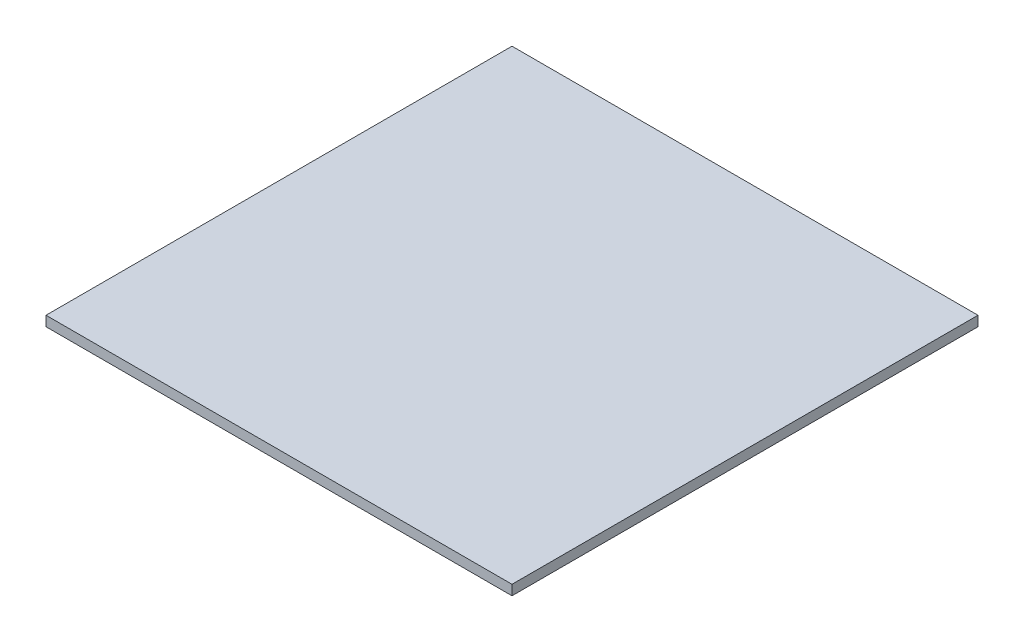
ISO-10303-21;
HEADER;
FILE_DESCRIPTION(('STEP AP214'),'2;1');
FILE_NAME('part.step','',(''),(''),'','','');
FILE_SCHEMA(('AUTOMOTIVE_DESIGN { 1 0 10303 214 1 1 1 1 }'));
ENDSEC;
DATA;
#1=APPLICATION_CONTEXT('core data for automotive mechanical design processes');
#2=APPLICATION_PROTOCOL_DEFINITION('international standard','automotive_design',2000,#1);
#3=PRODUCT_CONTEXT('',#1,'mechanical');
#4=PRODUCT('Part','Part','',(#3));
#5=PRODUCT_RELATED_PRODUCT_CATEGORY('part','',(#4));
#6=PRODUCT_DEFINITION_FORMATION('','',#4);
#7=PRODUCT_DEFINITION_CONTEXT('part definition',#1,'design');
#8=PRODUCT_DEFINITION('design','',#6,#7);
#9=PRODUCT_DEFINITION_SHAPE('','',#8);
#10=(LENGTH_UNIT() NAMED_UNIT(*) SI_UNIT(.MILLI.,.METRE.));
#11=(NAMED_UNIT(*) PLANE_ANGLE_UNIT() SI_UNIT($,.RADIAN.));
#12=(NAMED_UNIT(*) SI_UNIT($,.STERADIAN.) SOLID_ANGLE_UNIT());
#13=UNCERTAINTY_MEASURE_WITH_UNIT(LENGTH_MEASURE(1.E-05),#10,'distance_accuracy_value','');
#14=(GEOMETRIC_REPRESENTATION_CONTEXT(3) GLOBAL_UNCERTAINTY_ASSIGNED_CONTEXT((#13)) GLOBAL_UNIT_ASSIGNED_CONTEXT((#10,
#11,#12)) REPRESENTATION_CONTEXT('',''));
#15=CARTESIAN_POINT('',(0.,0.,0.));
#16=DIRECTION('',(0.,0.,1.));
#17=DIRECTION('',(1.,0.,0.));
#18=AXIS2_PLACEMENT_3D('',#15,#16,#17);
#19=CARTESIAN_POINT('',(0.,6.,0.));
#20=DIRECTION('',(-1.,0.,0.));
#21=DIRECTION('',(0.,0.,1.));
#22=AXIS2_PLACEMENT_3D('',#19,#20,#21);
#23=PLANE('',#22);
#24=DIRECTION('',(0.,0.,-1.));
#25=VECTOR('',#24,1.);
#26=CARTESIAN_POINT('',(0.,0.,0.));
#27=LINE('',#26,#25);
#28=CARTESIAN_POINT('',(0.,0.,0.));
#29=VERTEX_POINT('',#28);
#30=CARTESIAN_POINT('',(0.,0.,-280.));
#31=VERTEX_POINT('',#30);
#32=EDGE_CURVE('E98',#29,#31,#27,.T.);
#33=ORIENTED_EDGE('',*,*,#32,.F.);
#34=DIRECTION('',(0.,-1.,0.));
#35=VECTOR('',#34,1.);
#36=CARTESIAN_POINT('',(0.,6.,0.));
#37=LINE('',#36,#35);
#38=CARTESIAN_POINT('',(0.,6.,0.));
#39=VERTEX_POINT('',#38);
#40=EDGE_CURVE('E11',#39,#29,#37,.T.);
#41=ORIENTED_EDGE('',*,*,#40,.F.);
#42=DIRECTION('',(0.,0.,-1.));
#43=VECTOR('',#42,1.);
#44=CARTESIAN_POINT('',(0.,6.,0.));
#45=LINE('',#44,#43);
#46=CARTESIAN_POINT('',(0.,6.,-280.));
#47=VERTEX_POINT('',#46);
#48=EDGE_CURVE('E93',#39,#47,#45,.T.);
#49=ORIENTED_EDGE('',*,*,#48,.T.);
#50=DIRECTION('',(0.,-1.,0.));
#51=VECTOR('',#50,1.);
#52=CARTESIAN_POINT('',(0.,6.,-280.));
#53=LINE('',#52,#51);
#54=EDGE_CURVE('E36',#47,#31,#53,.T.);
#55=ORIENTED_EDGE('',*,*,#54,.T.);
#56=EDGE_LOOP('',(#33,#41,#49,#55));
#57=FACE_BOUND('',#56,.T.);
#58=ADVANCED_FACE('F33',(#57),#23,.T.);
#59=CARTESIAN_POINT('',(0.,6.,0.));
#60=DIRECTION('',(0.,0.,-1.));
#61=DIRECTION('',(-1.,0.,0.));
#62=AXIS2_PLACEMENT_3D('',#59,#60,#61);
#63=PLANE('',#62);
#64=DIRECTION('',(1.,0.,0.));
#65=VECTOR('',#64,1.);
#66=CARTESIAN_POINT('',(0.,0.,0.));
#67=LINE('',#66,#65);
#68=CARTESIAN_POINT('',(280.,0.,0.));
#69=VERTEX_POINT('',#68);
#70=EDGE_CURVE('E66',#29,#69,#67,.T.);
#71=ORIENTED_EDGE('',*,*,#70,.T.);
#72=DIRECTION('',(0.,-1.,0.));
#73=VECTOR('',#72,1.);
#74=CARTESIAN_POINT('',(280.,6.,0.));
#75=LINE('',#74,#73);
#76=CARTESIAN_POINT('',(280.,6.,0.));
#77=VERTEX_POINT('',#76);
#78=EDGE_CURVE('E42',#77,#69,#75,.T.);
#79=ORIENTED_EDGE('',*,*,#78,.F.);
#80=DIRECTION('',(1.,0.,0.));
#81=VECTOR('',#80,1.);
#82=CARTESIAN_POINT('',(0.,6.,0.));
#83=LINE('',#82,#81);
#84=EDGE_CURVE('E83',#39,#77,#83,.T.);
#85=ORIENTED_EDGE('',*,*,#84,.F.);
#86=ORIENTED_EDGE('',*,*,#40,.T.);
#87=EDGE_LOOP('',(#71,#79,#85,#86));
#88=FACE_BOUND('',#87,.T.);
#89=ADVANCED_FACE('F108',(#88),#63,.F.);
#90=CARTESIAN_POINT('',(280.,6.,0.));
#91=DIRECTION('',(-1.,0.,0.));
#92=DIRECTION('',(0.,0.,1.));
#93=AXIS2_PLACEMENT_3D('',#90,#91,#92);
#94=PLANE('',#93);
#95=DIRECTION('',(0.,0.,-1.));
#96=VECTOR('',#95,1.);
#97=CARTESIAN_POINT('',(280.,0.,0.));
#98=LINE('',#97,#96);
#99=CARTESIAN_POINT('',(280.,0.,-280.));
#100=VERTEX_POINT('',#99);
#101=EDGE_CURVE('E90',#69,#100,#98,.T.);
#102=ORIENTED_EDGE('',*,*,#101,.T.);
#103=DIRECTION('',(0.,-1.,0.));
#104=VECTOR('',#103,1.);
#105=CARTESIAN_POINT('',(280.,6.,-280.));
#106=LINE('',#105,#104);
#107=CARTESIAN_POINT('',(280.,6.,-280.));
#108=VERTEX_POINT('',#107);
#109=EDGE_CURVE('E87',#108,#100,#106,.T.);
#110=ORIENTED_EDGE('',*,*,#109,.F.);
#111=DIRECTION('',(0.,0.,-1.));
#112=VECTOR('',#111,1.);
#113=CARTESIAN_POINT('',(280.,6.,0.));
#114=LINE('',#113,#112);
#115=EDGE_CURVE('E78',#77,#108,#114,.T.);
#116=ORIENTED_EDGE('',*,*,#115,.F.);
#117=ORIENTED_EDGE('',*,*,#78,.T.);
#118=EDGE_LOOP('',(#102,#110,#116,#117));
#119=FACE_BOUND('',#118,.T.);
#120=ADVANCED_FACE('F88',(#119),#94,.F.);
#121=CARTESIAN_POINT('',(0.,6.,-280.));
#122=DIRECTION('',(0.,0.,-1.));
#123=DIRECTION('',(-1.,0.,0.));
#124=AXIS2_PLACEMENT_3D('',#121,#122,#123);
#125=PLANE('',#124);
#126=DIRECTION('',(1.,0.,0.));
#127=VECTOR('',#126,1.);
#128=CARTESIAN_POINT('',(0.,0.,-280.));
#129=LINE('',#128,#127);
#130=EDGE_CURVE('E101',#31,#100,#129,.T.);
#131=ORIENTED_EDGE('',*,*,#130,.F.);
#132=ORIENTED_EDGE('',*,*,#54,.F.);
#133=DIRECTION('',(1.,0.,0.));
#134=VECTOR('',#133,1.);
#135=CARTESIAN_POINT('',(0.,6.,-280.));
#136=LINE('',#135,#134);
#137=EDGE_CURVE('E82',#47,#108,#136,.T.);
#138=ORIENTED_EDGE('',*,*,#137,.T.);
#139=ORIENTED_EDGE('',*,*,#109,.T.);
#140=EDGE_LOOP('',(#131,#132,#138,#139));
#141=FACE_BOUND('',#140,.T.);
#142=ADVANCED_FACE('F92',(#141),#125,.T.);
#143=CARTESIAN_POINT('',(0.,6.,0.));
#144=DIRECTION('',(0.,-1.,0.));
#145=DIRECTION('',(0.,0.,-1.));
#146=AXIS2_PLACEMENT_3D('',#143,#144,#145);
#147=PLANE('',#146);
#148=ORIENTED_EDGE('',*,*,#48,.F.);
#149=ORIENTED_EDGE('',*,*,#84,.T.);
#150=ORIENTED_EDGE('',*,*,#115,.T.);
#151=ORIENTED_EDGE('',*,*,#137,.F.);
#152=EDGE_LOOP('',(#148,#149,#150,#151));
#153=FACE_BOUND('',#152,.T.);
#154=ADVANCED_FACE('F81',(#153),#147,.F.);
#155=CARTESIAN_POINT('',(0.,0.,0.));
#156=DIRECTION('',(0.,-1.,0.));
#157=DIRECTION('',(0.,0.,-1.));
#158=AXIS2_PLACEMENT_3D('',#155,#156,#157);
#159=PLANE('',#158);
#160=ORIENTED_EDGE('',*,*,#32,.T.);
#161=ORIENTED_EDGE('',*,*,#130,.T.);
#162=ORIENTED_EDGE('',*,*,#101,.F.);
#163=ORIENTED_EDGE('',*,*,#70,.F.);
#164=EDGE_LOOP('',(#160,#161,#162,#163));
#165=FACE_BOUND('',#164,.T.);
#166=ADVANCED_FACE('F106',(#165),#159,.T.);
#167=CLOSED_SHELL('',(#58,#89,#120,#142,#154,#166));
#168=MANIFOLD_SOLID_BREP('B2',#167);
#169=ADVANCED_BREP_SHAPE_REPRESENTATION('',(#18,#168),#14);
#170=SHAPE_DEFINITION_REPRESENTATION(#9,#169);
ENDSEC;
END-ISO-10303-21;
